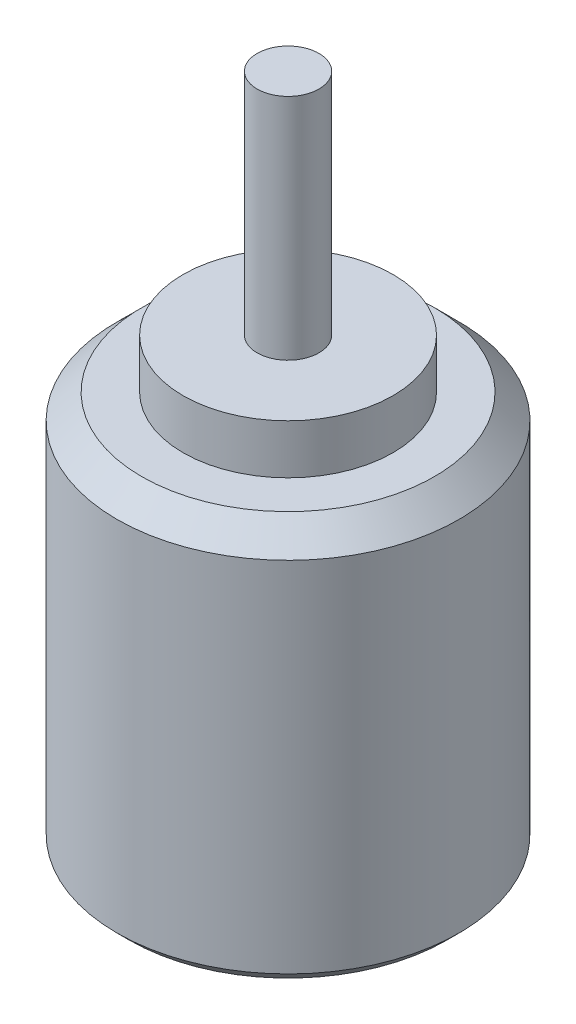
ISO-10303-21;
HEADER;
FILE_DESCRIPTION(('STEP AP214'),'2;1');
FILE_NAME('part.step','',(''),(''),'','','');
FILE_SCHEMA(('AUTOMOTIVE_DESIGN { 1 0 10303 214 1 1 1 1 }'));
ENDSEC;
DATA;
#1=APPLICATION_CONTEXT('core data for automotive mechanical design processes');
#2=APPLICATION_PROTOCOL_DEFINITION('international standard','automotive_design',2000,#1);
#3=PRODUCT_CONTEXT('',#1,'mechanical');
#4=PRODUCT('Part','Part','',(#3));
#5=PRODUCT_RELATED_PRODUCT_CATEGORY('part','',(#4));
#6=PRODUCT_DEFINITION_FORMATION('','',#4);
#7=PRODUCT_DEFINITION_CONTEXT('part definition',#1,'design');
#8=PRODUCT_DEFINITION('design','',#6,#7);
#9=PRODUCT_DEFINITION_SHAPE('','',#8);
#10=(LENGTH_UNIT() NAMED_UNIT(*) SI_UNIT(.MILLI.,.METRE.));
#11=(NAMED_UNIT(*) PLANE_ANGLE_UNIT() SI_UNIT($,.RADIAN.));
#12=(NAMED_UNIT(*) SI_UNIT($,.STERADIAN.) SOLID_ANGLE_UNIT());
#13=UNCERTAINTY_MEASURE_WITH_UNIT(LENGTH_MEASURE(1.E-05),#10,'distance_accuracy_value','');
#14=(GEOMETRIC_REPRESENTATION_CONTEXT(3) GLOBAL_UNCERTAINTY_ASSIGNED_CONTEXT((#13)) GLOBAL_UNIT_ASSIGNED_CONTEXT((#10,
#11,#12)) REPRESENTATION_CONTEXT('',''));
#15=CARTESIAN_POINT('',(0.,0.,0.));
#16=DIRECTION('',(0.,0.,1.));
#17=DIRECTION('',(1.,0.,0.));
#18=AXIS2_PLACEMENT_3D('',#15,#16,#17);
#19=CARTESIAN_POINT('',(0.,32.,0.));
#20=DIRECTION('',(0.,-1.,0.));
#21=DIRECTION('',(0.,0.,-1.));
#22=AXIS2_PLACEMENT_3D('',#19,#20,#21);
#23=CYLINDRICAL_SURFACE('',#22,13.85);
#24=CARTESIAN_POINT('',(0.,0.999999999999987,0.));
#25=DIRECTION('',(0.,1.,0.));
#26=DIRECTION('',(0.,0.,1.));
#27=AXIS2_PLACEMENT_3D('',#24,#25,#26);
#28=CIRCLE('',#27,13.85);
#29=CARTESIAN_POINT('',(0.,0.999999999999987,13.85));
#30=VERTEX_POINT('',#29);
#31=EDGE_CURVE('E43',#30,#30,#28,.T.);
#32=ORIENTED_EDGE('',*,*,#31,.T.);
#33=EDGE_LOOP('',(#32));
#34=FACE_BOUND('',#33,.T.);
#35=CARTESIAN_POINT('',(0.,30.,0.));
#36=DIRECTION('',(0.,1.,0.));
#37=DIRECTION('',(0.,0.,1.));
#38=AXIS2_PLACEMENT_3D('',#35,#36,#37);
#39=CIRCLE('',#38,13.85);
#40=CARTESIAN_POINT('',(0.,30.,13.85));
#41=VERTEX_POINT('',#40);
#42=EDGE_CURVE('E47',#41,#41,#39,.F.);
#43=ORIENTED_EDGE('',*,*,#42,.T.);
#44=EDGE_LOOP('',(#43));
#45=FACE_BOUND('',#44,.T.);
#46=ADVANCED_FACE('F36',(#34,#45),#23,.T.);
#47=CARTESIAN_POINT('',(0.,32.,0.));
#48=DIRECTION('',(0.,1.,0.));
#49=DIRECTION('',(0.,0.,1.));
#50=AXIS2_PLACEMENT_3D('',#47,#48,#49);
#51=PLANE('',#50);
#52=CARTESIAN_POINT('',(0.,32.,0.));
#53=DIRECTION('',(0.,1.,0.));
#54=DIRECTION('',(0.,0.,1.));
#55=AXIS2_PLACEMENT_3D('',#52,#53,#54);
#56=CIRCLE('',#55,11.85);
#57=CARTESIAN_POINT('',(0.,32.,11.85));
#58=VERTEX_POINT('',#57);
#59=EDGE_CURVE('E51',#58,#58,#56,.T.);
#60=ORIENTED_EDGE('',*,*,#59,.T.);
#61=EDGE_LOOP('',(#60));
#62=FACE_BOUND('',#61,.T.);
#63=CARTESIAN_POINT('',(0.,32.,0.));
#64=DIRECTION('',(0.,1.,0.));
#65=DIRECTION('',(0.,0.,1.));
#66=AXIS2_PLACEMENT_3D('',#63,#64,#65);
#67=CIRCLE('',#66,8.5);
#68=CARTESIAN_POINT('',(0.,32.,8.5));
#69=VERTEX_POINT('',#68);
#70=EDGE_CURVE('E60',#69,#69,#67,.T.);
#71=ORIENTED_EDGE('',*,*,#70,.F.);
#72=EDGE_LOOP('',(#71));
#73=FACE_BOUND('',#72,.T.);
#74=ADVANCED_FACE('F112',(#62,#73),#51,.T.);
#75=CARTESIAN_POINT('',(0.,0.,0.));
#76=DIRECTION('',(0.,1.,0.));
#77=DIRECTION('',(0.,0.,1.));
#78=AXIS2_PLACEMENT_3D('',#75,#76,#77);
#79=PLANE('',#78);
#80=CARTESIAN_POINT('',(0.,0.,7.8));
#81=DIRECTION('',(0.,-1.,0.));
#82=DIRECTION('',(0.,0.,-1.));
#83=AXIS2_PLACEMENT_3D('',#80,#81,#82);
#84=CIRCLE('',#83,1.35);
#85=CARTESIAN_POINT('',(0.,0.,6.45));
#86=VERTEX_POINT('',#85);
#87=EDGE_CURVE('E93',#86,#86,#84,.T.);
#88=ORIENTED_EDGE('',*,*,#87,.F.);
#89=EDGE_LOOP('',(#88));
#90=FACE_BOUND('',#89,.T.);
#91=CARTESIAN_POINT('',(-9.3,0.,0.));
#92=DIRECTION('',(0.,-1.,0.));
#93=DIRECTION('',(0.,0.,-1.));
#94=AXIS2_PLACEMENT_3D('',#91,#92,#93);
#95=CIRCLE('',#94,1.35);
#96=CARTESIAN_POINT('',(-9.3,0.,-1.35));
#97=VERTEX_POINT('',#96);
#98=EDGE_CURVE('E87',#97,#97,#95,.T.);
#99=ORIENTED_EDGE('',*,*,#98,.F.);
#100=EDGE_LOOP('',(#99));
#101=FACE_BOUND('',#100,.T.);
#102=CARTESIAN_POINT('',(0.,0.,-7.8));
#103=DIRECTION('',(0.,-1.,0.));
#104=DIRECTION('',(0.,0.,-1.));
#105=AXIS2_PLACEMENT_3D('',#102,#103,#104);
#106=CIRCLE('',#105,1.35);
#107=CARTESIAN_POINT('',(0.,0.,-9.15));
#108=VERTEX_POINT('',#107);
#109=EDGE_CURVE('E81',#108,#108,#106,.T.);
#110=ORIENTED_EDGE('',*,*,#109,.F.);
#111=EDGE_LOOP('',(#110));
#112=FACE_BOUND('',#111,.T.);
#113=CARTESIAN_POINT('',(9.3,0.,0.));
#114=DIRECTION('',(0.,-1.,0.));
#115=DIRECTION('',(0.,0.,-1.));
#116=AXIS2_PLACEMENT_3D('',#113,#114,#115);
#117=CIRCLE('',#116,1.35);
#118=CARTESIAN_POINT('',(9.3,0.,-1.35));
#119=VERTEX_POINT('',#118);
#120=EDGE_CURVE('E75',#119,#119,#117,.T.);
#121=ORIENTED_EDGE('',*,*,#120,.F.);
#122=EDGE_LOOP('',(#121));
#123=FACE_BOUND('',#122,.T.);
#124=CARTESIAN_POINT('',(0.,0.,0.));
#125=DIRECTION('',(0.,1.,0.));
#126=DIRECTION('',(0.,0.,1.));
#127=AXIS2_PLACEMENT_3D('',#124,#125,#126);
#128=CIRCLE('',#127,12.85);
#129=CARTESIAN_POINT('',(0.,0.,12.85));
#130=VERTEX_POINT('',#129);
#131=EDGE_CURVE('E10',#130,#130,#128,.F.);
#132=ORIENTED_EDGE('',*,*,#131,.T.);
#133=EDGE_LOOP('',(#132));
#134=FACE_BOUND('',#133,.T.);
#135=CARTESIAN_POINT('',(0.,0.,0.));
#136=DIRECTION('',(0.,-1.,0.));
#137=DIRECTION('',(0.,0.,-1.));
#138=AXIS2_PLACEMENT_3D('',#135,#136,#137);
#139=CIRCLE('',#138,2.5);
#140=CARTESIAN_POINT('',(0.,0.,-2.5));
#141=VERTEX_POINT('',#140);
#142=EDGE_CURVE('E57',#141,#141,#139,.T.);
#143=ORIENTED_EDGE('',*,*,#142,.F.);
#144=EDGE_LOOP('',(#143));
#145=FACE_BOUND('',#144,.T.);
#146=ADVANCED_FACE('F108',(#90,#101,#112,#123,#134,#145),#79,.F.);
#147=CARTESIAN_POINT('',(0.,-2.5,0.));
#148=DIRECTION('',(0.,1.,0.));
#149=DIRECTION('',(0.,0.,1.));
#150=AXIS2_PLACEMENT_3D('',#147,#148,#149);
#151=CYLINDRICAL_SURFACE('',#150,2.5);
#152=CARTESIAN_POINT('',(0.,-2.5,0.));
#153=DIRECTION('',(0.,-1.,0.));
#154=DIRECTION('',(0.,0.,-1.));
#155=AXIS2_PLACEMENT_3D('',#152,#153,#154);
#156=CIRCLE('',#155,2.5);
#157=CARTESIAN_POINT('',(0.,-2.5,-2.5));
#158=VERTEX_POINT('',#157);
#159=EDGE_CURVE('E61',#158,#158,#156,.T.);
#160=ORIENTED_EDGE('',*,*,#159,.F.);
#161=EDGE_LOOP('',(#160));
#162=FACE_BOUND('',#161,.T.);
#163=ORIENTED_EDGE('',*,*,#142,.T.);
#164=EDGE_LOOP('',(#163));
#165=FACE_BOUND('',#164,.T.);
#166=ADVANCED_FACE('F111',(#162,#165),#151,.T.);
#167=CARTESIAN_POINT('',(0.,-2.5,0.));
#168=DIRECTION('',(0.,-1.,0.));
#169=DIRECTION('',(0.,0.,-1.));
#170=AXIS2_PLACEMENT_3D('',#167,#168,#169);
#171=PLANE('',#170);
#172=ORIENTED_EDGE('',*,*,#159,.T.);
#173=EDGE_LOOP('',(#172));
#174=FACE_BOUND('',#173,.T.);
#175=ADVANCED_FACE('F123',(#174),#171,.T.);
#176=CARTESIAN_POINT('',(0.,36.,0.));
#177=DIRECTION('',(0.,-1.,0.));
#178=DIRECTION('',(0.,0.,-1.));
#179=AXIS2_PLACEMENT_3D('',#176,#177,#178);
#180=CYLINDRICAL_SURFACE('',#179,8.5);
#181=CARTESIAN_POINT('',(0.,36.,0.));
#182=DIRECTION('',(0.,1.,0.));
#183=DIRECTION('',(0.,0.,1.));
#184=AXIS2_PLACEMENT_3D('',#181,#182,#183);
#185=CIRCLE('',#184,8.5);
#186=CARTESIAN_POINT('',(0.,36.,8.5));
#187=VERTEX_POINT('',#186);
#188=EDGE_CURVE('E64',#187,#187,#185,.T.);
#189=ORIENTED_EDGE('',*,*,#188,.F.);
#190=EDGE_LOOP('',(#189));
#191=FACE_BOUND('',#190,.T.);
#192=ORIENTED_EDGE('',*,*,#70,.T.);
#193=EDGE_LOOP('',(#192));
#194=FACE_BOUND('',#193,.T.);
#195=ADVANCED_FACE('F130',(#191,#194),#180,.T.);
#196=CARTESIAN_POINT('',(0.,36.,0.));
#197=DIRECTION('',(0.,1.,0.));
#198=DIRECTION('',(0.,0.,1.));
#199=AXIS2_PLACEMENT_3D('',#196,#197,#198);
#200=PLANE('',#199);
#201=CARTESIAN_POINT('',(0.,36.,0.));
#202=DIRECTION('',(0.,1.,0.));
#203=DIRECTION('',(0.,0.,1.));
#204=AXIS2_PLACEMENT_3D('',#201,#202,#203);
#205=CIRCLE('',#204,2.5);
#206=CARTESIAN_POINT('',(0.,36.,2.5));
#207=VERTEX_POINT('',#206);
#208=EDGE_CURVE('E56',#207,#207,#205,.T.);
#209=ORIENTED_EDGE('',*,*,#208,.F.);
#210=EDGE_LOOP('',(#209));
#211=FACE_BOUND('',#210,.T.);
#212=ORIENTED_EDGE('',*,*,#188,.T.);
#213=EDGE_LOOP('',(#212));
#214=FACE_BOUND('',#213,.T.);
#215=ADVANCED_FACE('F162',(#211,#214),#200,.T.);
#216=CARTESIAN_POINT('',(0.,54.5,0.));
#217=DIRECTION('',(0.,-1.,0.));
#218=DIRECTION('',(0.,0.,-1.));
#219=AXIS2_PLACEMENT_3D('',#216,#217,#218);
#220=CYLINDRICAL_SURFACE('',#219,2.5);
#221=CARTESIAN_POINT('',(0.,54.5,0.));
#222=DIRECTION('',(0.,1.,0.));
#223=DIRECTION('',(0.,0.,1.));
#224=AXIS2_PLACEMENT_3D('',#221,#222,#223);
#225=CIRCLE('',#224,2.5);
#226=CARTESIAN_POINT('',(0.,54.5,2.5));
#227=VERTEX_POINT('',#226);
#228=EDGE_CURVE('E69',#227,#227,#225,.T.);
#229=ORIENTED_EDGE('',*,*,#228,.F.);
#230=EDGE_LOOP('',(#229));
#231=FACE_BOUND('',#230,.T.);
#232=ORIENTED_EDGE('',*,*,#208,.T.);
#233=EDGE_LOOP('',(#232));
#234=FACE_BOUND('',#233,.T.);
#235=ADVANCED_FACE('F152',(#231,#234),#220,.T.);
#236=CARTESIAN_POINT('',(0.,54.5,0.));
#237=DIRECTION('',(0.,1.,0.));
#238=DIRECTION('',(0.,0.,1.));
#239=AXIS2_PLACEMENT_3D('',#236,#237,#238);
#240=PLANE('',#239);
#241=ORIENTED_EDGE('',*,*,#228,.T.);
#242=EDGE_LOOP('',(#241));
#243=FACE_BOUND('',#242,.T.);
#244=ADVANCED_FACE('F144',(#243),#240,.T.);
#245=CARTESIAN_POINT('',(0.,32.,0.));
#246=DIRECTION('',(0.,-1.,0.));
#247=DIRECTION('',(0.,0.,-1.));
#248=AXIS2_PLACEMENT_3D('',#245,#246,#247);
#249=CONICAL_SURFACE('',#248,11.85,0.785398163397443);
#250=ORIENTED_EDGE('',*,*,#42,.F.);
#251=EDGE_LOOP('',(#250));
#252=FACE_BOUND('',#251,.T.);
#253=ORIENTED_EDGE('',*,*,#59,.F.);
#254=EDGE_LOOP('',(#253));
#255=FACE_BOUND('',#254,.T.);
#256=ADVANCED_FACE('F142',(#252,#255),#249,.T.);
#257=CARTESIAN_POINT('',(0.,0.999999999999987,0.));
#258=DIRECTION('',(0.,1.,0.));
#259=DIRECTION('',(0.,0.,1.));
#260=AXIS2_PLACEMENT_3D('',#257,#258,#259);
#261=CONICAL_SURFACE('',#260,13.85,0.78539816339745);
#262=ORIENTED_EDGE('',*,*,#131,.F.);
#263=EDGE_LOOP('',(#262));
#264=FACE_BOUND('',#263,.T.);
#265=ORIENTED_EDGE('',*,*,#31,.F.);
#266=EDGE_LOOP('',(#265));
#267=FACE_BOUND('',#266,.T.);
#268=ADVANCED_FACE('F38',(#264,#267),#261,.T.);
#269=CARTESIAN_POINT('',(9.3,3.,0.));
#270=DIRECTION('',(0.,-1.,0.));
#271=DIRECTION('',(0.,0.,-1.));
#272=AXIS2_PLACEMENT_3D('',#269,#270,#271);
#273=CYLINDRICAL_SURFACE('',#272,1.35);
#274=CARTESIAN_POINT('',(9.3,3.,0.));
#275=DIRECTION('',(0.,-1.,0.));
#276=DIRECTION('',(0.,0.,-1.));
#277=AXIS2_PLACEMENT_3D('',#274,#275,#276);
#278=CIRCLE('',#277,1.35);
#279=CARTESIAN_POINT('',(9.3,3.,-1.35));
#280=VERTEX_POINT('',#279);
#281=EDGE_CURVE('E78',#280,#280,#278,.T.);
#282=ORIENTED_EDGE('',*,*,#281,.F.);
#283=EDGE_LOOP('',(#282));
#284=FACE_BOUND('',#283,.T.);
#285=ORIENTED_EDGE('',*,*,#120,.T.);
#286=EDGE_LOOP('',(#285));
#287=FACE_BOUND('',#286,.T.);
#288=ADVANCED_FACE('F150',(#284,#287),#273,.F.);
#289=CARTESIAN_POINT('',(9.3,3.,0.));
#290=DIRECTION('',(0.,-1.,0.));
#291=DIRECTION('',(0.,0.,-1.));
#292=AXIS2_PLACEMENT_3D('',#289,#290,#291);
#293=PLANE('',#292);
#294=ORIENTED_EDGE('',*,*,#281,.T.);
#295=EDGE_LOOP('',(#294));
#296=FACE_BOUND('',#295,.T.);
#297=ADVANCED_FACE('F177',(#296),#293,.T.);
#298=CARTESIAN_POINT('',(0.,3.,-7.8));
#299=DIRECTION('',(0.,-1.,0.));
#300=DIRECTION('',(0.,0.,-1.));
#301=AXIS2_PLACEMENT_3D('',#298,#299,#300);
#302=CYLINDRICAL_SURFACE('',#301,1.35);
#303=CARTESIAN_POINT('',(0.,3.,-7.8));
#304=DIRECTION('',(0.,-1.,0.));
#305=DIRECTION('',(0.,0.,-1.));
#306=AXIS2_PLACEMENT_3D('',#303,#304,#305);
#307=CIRCLE('',#306,1.35);
#308=CARTESIAN_POINT('',(0.,3.,-9.15));
#309=VERTEX_POINT('',#308);
#310=EDGE_CURVE('E84',#309,#309,#307,.T.);
#311=ORIENTED_EDGE('',*,*,#310,.F.);
#312=EDGE_LOOP('',(#311));
#313=FACE_BOUND('',#312,.T.);
#314=ORIENTED_EDGE('',*,*,#109,.T.);
#315=EDGE_LOOP('',(#314));
#316=FACE_BOUND('',#315,.T.);
#317=ADVANCED_FACE('F181',(#313,#316),#302,.F.);
#318=CARTESIAN_POINT('',(0.,3.,-7.8));
#319=DIRECTION('',(0.,-1.,0.));
#320=DIRECTION('',(0.,0.,-1.));
#321=AXIS2_PLACEMENT_3D('',#318,#319,#320);
#322=PLANE('',#321);
#323=ORIENTED_EDGE('',*,*,#310,.T.);
#324=EDGE_LOOP('',(#323));
#325=FACE_BOUND('',#324,.T.);
#326=ADVANCED_FACE('F185',(#325),#322,.T.);
#327=CARTESIAN_POINT('',(-9.3,3.,0.));
#328=DIRECTION('',(0.,-1.,0.));
#329=DIRECTION('',(0.,0.,-1.));
#330=AXIS2_PLACEMENT_3D('',#327,#328,#329);
#331=CYLINDRICAL_SURFACE('',#330,1.35);
#332=CARTESIAN_POINT('',(-9.3,3.,0.));
#333=DIRECTION('',(0.,-1.,0.));
#334=DIRECTION('',(0.,0.,-1.));
#335=AXIS2_PLACEMENT_3D('',#332,#333,#334);
#336=CIRCLE('',#335,1.35);
#337=CARTESIAN_POINT('',(-9.3,3.,-1.35));
#338=VERTEX_POINT('',#337);
#339=EDGE_CURVE('E90',#338,#338,#336,.T.);
#340=ORIENTED_EDGE('',*,*,#339,.F.);
#341=EDGE_LOOP('',(#340));
#342=FACE_BOUND('',#341,.T.);
#343=ORIENTED_EDGE('',*,*,#98,.T.);
#344=EDGE_LOOP('',(#343));
#345=FACE_BOUND('',#344,.T.);
#346=ADVANCED_FACE('F189',(#342,#345),#331,.F.);
#347=CARTESIAN_POINT('',(-9.3,3.,0.));
#348=DIRECTION('',(0.,-1.,0.));
#349=DIRECTION('',(0.,0.,-1.));
#350=AXIS2_PLACEMENT_3D('',#347,#348,#349);
#351=PLANE('',#350);
#352=ORIENTED_EDGE('',*,*,#339,.T.);
#353=EDGE_LOOP('',(#352));
#354=FACE_BOUND('',#353,.T.);
#355=ADVANCED_FACE('F104',(#354),#351,.T.);
#356=CARTESIAN_POINT('',(0.,3.,7.8));
#357=DIRECTION('',(0.,-1.,0.));
#358=DIRECTION('',(0.,0.,-1.));
#359=AXIS2_PLACEMENT_3D('',#356,#357,#358);
#360=CYLINDRICAL_SURFACE('',#359,1.35);
#361=CARTESIAN_POINT('',(0.,3.,7.8));
#362=DIRECTION('',(0.,-1.,0.));
#363=DIRECTION('',(0.,0.,-1.));
#364=AXIS2_PLACEMENT_3D('',#361,#362,#363);
#365=CIRCLE('',#364,1.35);
#366=CARTESIAN_POINT('',(0.,3.,6.45));
#367=VERTEX_POINT('',#366);
#368=EDGE_CURVE('E74',#367,#367,#365,.T.);
#369=ORIENTED_EDGE('',*,*,#368,.F.);
#370=EDGE_LOOP('',(#369));
#371=FACE_BOUND('',#370,.T.);
#372=ORIENTED_EDGE('',*,*,#87,.T.);
#373=EDGE_LOOP('',(#372));
#374=FACE_BOUND('',#373,.T.);
#375=ADVANCED_FACE('F101',(#371,#374),#360,.F.);
#376=CARTESIAN_POINT('',(0.,3.,7.8));
#377=DIRECTION('',(0.,-1.,0.));
#378=DIRECTION('',(0.,0.,-1.));
#379=AXIS2_PLACEMENT_3D('',#376,#377,#378);
#380=PLANE('',#379);
#381=ORIENTED_EDGE('',*,*,#368,.T.);
#382=EDGE_LOOP('',(#381));
#383=FACE_BOUND('',#382,.T.);
#384=ADVANCED_FACE('F99',(#383),#380,.T.);
#385=CLOSED_SHELL('',(#46,#74,#146,#166,#175,#195,#215,#235,#244,#256,#268,#288,#297,#317,#326,
#346,#355,#375,#384));
#386=MANIFOLD_SOLID_BREP('B2',#385);
#387=ADVANCED_BREP_SHAPE_REPRESENTATION('',(#18,#386),#14);
#388=SHAPE_DEFINITION_REPRESENTATION(#9,#387);
ENDSEC;
END-ISO-10303-21;
